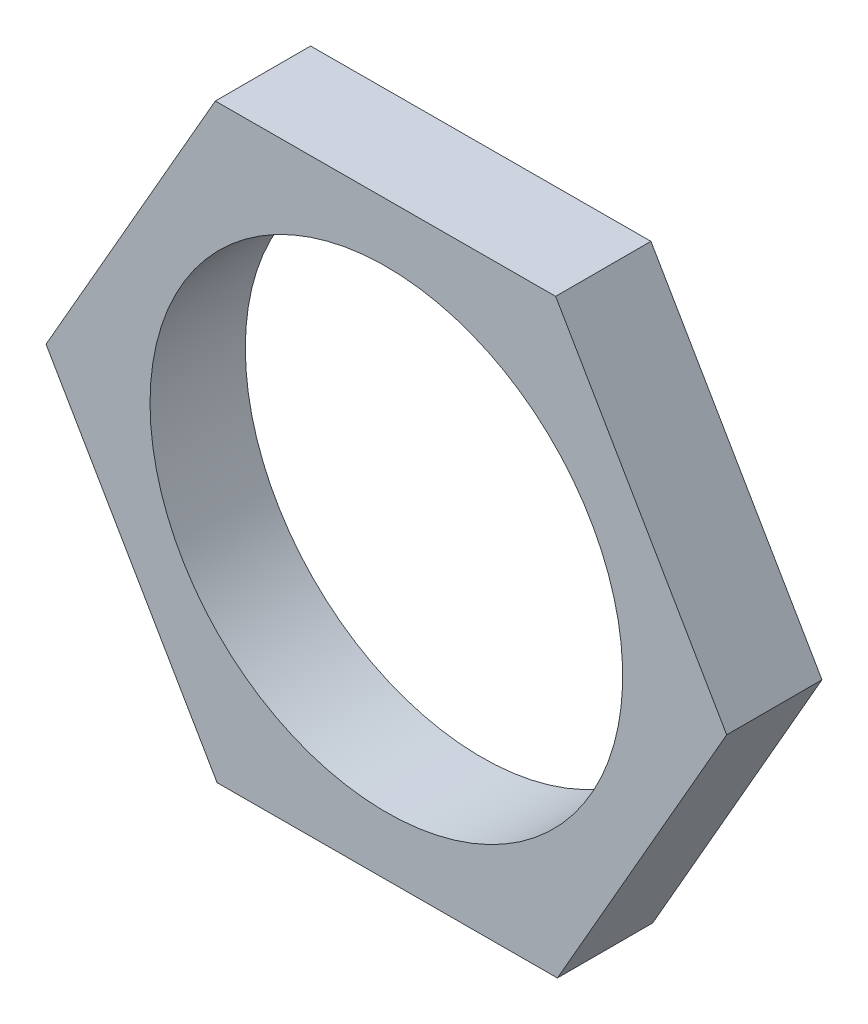
ISO-10303-21;
HEADER;
FILE_DESCRIPTION(('STEP AP214'),'2;1');
FILE_NAME('part.step','',(''),(''),'','','');
FILE_SCHEMA(('AUTOMOTIVE_DESIGN { 1 0 10303 214 1 1 1 1 }'));
ENDSEC;
DATA;
#1=APPLICATION_CONTEXT('core data for automotive mechanical design processes');
#2=APPLICATION_PROTOCOL_DEFINITION('international standard','automotive_design',2000,#1);
#3=PRODUCT_CONTEXT('',#1,'mechanical');
#4=PRODUCT('Part','Part','',(#3));
#5=PRODUCT_RELATED_PRODUCT_CATEGORY('part','',(#4));
#6=PRODUCT_DEFINITION_FORMATION('','',#4);
#7=PRODUCT_DEFINITION_CONTEXT('part definition',#1,'design');
#8=PRODUCT_DEFINITION('design','',#6,#7);
#9=PRODUCT_DEFINITION_SHAPE('','',#8);
#10=(LENGTH_UNIT() NAMED_UNIT(*) SI_UNIT(.MILLI.,.METRE.));
#11=(NAMED_UNIT(*) PLANE_ANGLE_UNIT() SI_UNIT($,.RADIAN.));
#12=(NAMED_UNIT(*) SI_UNIT($,.STERADIAN.) SOLID_ANGLE_UNIT());
#13=UNCERTAINTY_MEASURE_WITH_UNIT(LENGTH_MEASURE(1.E-05),#10,'distance_accuracy_value','');
#14=(GEOMETRIC_REPRESENTATION_CONTEXT(3) GLOBAL_UNCERTAINTY_ASSIGNED_CONTEXT((#13)) GLOBAL_UNIT_ASSIGNED_CONTEXT((#10,
#11,#12)) REPRESENTATION_CONTEXT('',''));
#15=CARTESIAN_POINT('',(0.,0.,0.));
#16=DIRECTION('',(0.,0.,1.));
#17=DIRECTION('',(1.,0.,0.));
#18=AXIS2_PLACEMENT_3D('',#15,#16,#17);
#19=CARTESIAN_POINT('',(7.14371837927621,0.021255119177275,2.));
#20=DIRECTION('',(-0.864533898071232,-0.502574510978981,0.));
#21=DIRECTION('',(0.502574510978981,-0.864533898071232,0.));
#22=AXIS2_PLACEMENT_3D('',#19,#20,#21);
#23=PLANE('',#22);
#24=DIRECTION('',(-0.502574510978981,0.864533898071232,0.));
#25=VECTOR('',#24,1.);
#26=CARTESIAN_POINT('',(7.14371837927621,0.021255119177275,0.));
#27=LINE('',#26,#25);
#28=CARTESIAN_POINT('',(7.14371837927621,0.021255119177275,0.));
#29=VERTEX_POINT('',#28);
#30=CARTESIAN_POINT('',(3.55345171647012,6.19726915352364,0.));
#31=VERTEX_POINT('',#30);
#32=EDGE_CURVE('E115',#29,#31,#27,.T.);
#33=ORIENTED_EDGE('',*,*,#32,.T.);
#34=DIRECTION('',(0.,0.,-1.));
#35=VECTOR('',#34,1.);
#36=CARTESIAN_POINT('',(3.55345171647012,6.19726915352364,2.));
#37=LINE('',#36,#35);
#38=CARTESIAN_POINT('',(3.55345171647012,6.19726915352364,2.));
#39=VERTEX_POINT('',#38);
#40=EDGE_CURVE('E11',#39,#31,#37,.T.);
#41=ORIENTED_EDGE('',*,*,#40,.F.);
#42=DIRECTION('',(-0.502574510978981,0.864533898071232,0.));
#43=VECTOR('',#42,1.);
#44=CARTESIAN_POINT('',(7.14371837927621,0.021255119177275,2.));
#45=LINE('',#44,#43);
#46=CARTESIAN_POINT('',(7.14371837927621,0.021255119177275,2.));
#47=VERTEX_POINT('',#46);
#48=EDGE_CURVE('E126',#47,#39,#45,.T.);
#49=ORIENTED_EDGE('',*,*,#48,.F.);
#50=DIRECTION('',(0.,0.,-1.));
#51=VECTOR('',#50,1.);
#52=CARTESIAN_POINT('',(7.14371837927621,0.021255119177275,2.));
#53=LINE('',#52,#51);
#54=EDGE_CURVE('E111',#47,#29,#53,.T.);
#55=ORIENTED_EDGE('',*,*,#54,.T.);
#56=EDGE_LOOP('',(#33,#41,#49,#55));
#57=FACE_BOUND('',#56,.T.);
#58=ADVANCED_FACE('F31',(#57),#23,.F.);
#59=CARTESIAN_POINT('',(3.55345171647012,6.19726915352364,2.));
#60=DIRECTION('',(0.00297534476672245,-0.999995573651963,0.));
#61=DIRECTION('',(0.999995573651963,0.00297534476672245,0.));
#62=AXIS2_PLACEMENT_3D('',#59,#60,#61);
#63=PLANE('',#62);
#64=DIRECTION('',(-0.999995573651963,-0.00297534476672245,0.));
#65=VECTOR('',#64,1.);
#66=CARTESIAN_POINT('',(3.55345171647012,6.19726915352364,0.));
#67=LINE('',#66,#65);
#68=CARTESIAN_POINT('',(-3.59026666280609,6.17601403434636,0.));
#69=VERTEX_POINT('',#68);
#70=EDGE_CURVE('E118',#31,#69,#67,.T.);
#71=ORIENTED_EDGE('',*,*,#70,.T.);
#72=DIRECTION('',(0.,0.,-1.));
#73=VECTOR('',#72,1.);
#74=CARTESIAN_POINT('',(-3.59026666280609,6.17601403434636,2.));
#75=LINE('',#74,#73);
#76=CARTESIAN_POINT('',(-3.59026666280609,6.17601403434636,2.));
#77=VERTEX_POINT('',#76);
#78=EDGE_CURVE('E39',#77,#69,#75,.T.);
#79=ORIENTED_EDGE('',*,*,#78,.F.);
#80=DIRECTION('',(-0.999995573651963,-0.00297534476672245,0.));
#81=VECTOR('',#80,1.);
#82=CARTESIAN_POINT('',(3.55345171647012,6.19726915352364,2.));
#83=LINE('',#82,#81);
#84=EDGE_CURVE('E84',#39,#77,#83,.T.);
#85=ORIENTED_EDGE('',*,*,#84,.F.);
#86=ORIENTED_EDGE('',*,*,#40,.T.);
#87=EDGE_LOOP('',(#71,#79,#85,#86));
#88=FACE_BOUND('',#87,.T.);
#89=ADVANCED_FACE('F151',(#88),#63,.F.);
#90=CARTESIAN_POINT('',(-3.59026666280609,6.17601403434636,2.));
#91=DIRECTION('',(0.867509242837954,-0.497421062672983,0.));
#92=DIRECTION('',(0.497421062672983,0.867509242837954,0.));
#93=AXIS2_PLACEMENT_3D('',#90,#91,#92);
#94=PLANE('',#93);
#95=DIRECTION('',(-0.497421062672983,-0.867509242837954,0.));
#96=VECTOR('',#95,1.);
#97=CARTESIAN_POINT('',(-3.59026666280609,6.17601403434636,0.));
#98=LINE('',#97,#96);
#99=CARTESIAN_POINT('',(-7.14371837927621,-0.0212551191772762,0.));
#100=VERTEX_POINT('',#99);
#101=EDGE_CURVE('E121',#69,#100,#98,.T.);
#102=ORIENTED_EDGE('',*,*,#101,.T.);
#103=DIRECTION('',(0.,0.,-1.));
#104=VECTOR('',#103,1.);
#105=CARTESIAN_POINT('',(-7.14371837927621,-0.0212551191772762,2.));
#106=LINE('',#105,#104);
#107=CARTESIAN_POINT('',(-7.14371837927621,-0.0212551191772762,2.));
#108=VERTEX_POINT('',#107);
#109=EDGE_CURVE('E106',#108,#100,#106,.T.);
#110=ORIENTED_EDGE('',*,*,#109,.F.);
#111=DIRECTION('',(-0.497421062672983,-0.867509242837954,0.));
#112=VECTOR('',#111,1.);
#113=CARTESIAN_POINT('',(-3.59026666280609,6.17601403434636,2.));
#114=LINE('',#113,#112);
#115=EDGE_CURVE('E97',#77,#108,#114,.T.);
#116=ORIENTED_EDGE('',*,*,#115,.F.);
#117=ORIENTED_EDGE('',*,*,#78,.T.);
#118=EDGE_LOOP('',(#102,#110,#116,#117));
#119=FACE_BOUND('',#118,.T.);
#120=ADVANCED_FACE('F132',(#119),#94,.F.);
#121=CARTESIAN_POINT('',(-7.14371837927621,-0.0212551191772762,2.));
#122=DIRECTION('',(0.864533898071232,0.502574510978981,0.));
#123=DIRECTION('',(-0.502574510978981,0.864533898071232,0.));
#124=AXIS2_PLACEMENT_3D('',#121,#122,#123);
#125=PLANE('',#124);
#126=DIRECTION('',(0.502574510978981,-0.864533898071231,0.));
#127=VECTOR('',#126,1.);
#128=CARTESIAN_POINT('',(-7.14371837927621,-0.0212551191772762,0.));
#129=LINE('',#128,#127);
#130=CARTESIAN_POINT('',(-3.55345171647012,-6.19726915352364,0.));
#131=VERTEX_POINT('',#130);
#132=EDGE_CURVE('E105',#100,#131,#129,.T.);
#133=ORIENTED_EDGE('',*,*,#132,.T.);
#134=DIRECTION('',(0.,0.,-1.));
#135=VECTOR('',#134,1.);
#136=CARTESIAN_POINT('',(-3.55345171647012,-6.19726915352364,2.));
#137=LINE('',#136,#135);
#138=CARTESIAN_POINT('',(-3.55345171647012,-6.19726915352364,2.));
#139=VERTEX_POINT('',#138);
#140=EDGE_CURVE('E102',#139,#131,#137,.T.);
#141=ORIENTED_EDGE('',*,*,#140,.F.);
#142=DIRECTION('',(0.502574510978981,-0.864533898071231,0.));
#143=VECTOR('',#142,1.);
#144=CARTESIAN_POINT('',(-7.14371837927621,-0.0212551191772762,2.));
#145=LINE('',#144,#143);
#146=EDGE_CURVE('E91',#108,#139,#145,.T.);
#147=ORIENTED_EDGE('',*,*,#146,.F.);
#148=ORIENTED_EDGE('',*,*,#109,.T.);
#149=EDGE_LOOP('',(#133,#141,#147,#148));
#150=FACE_BOUND('',#149,.T.);
#151=ADVANCED_FACE('F103',(#150),#125,.F.);
#152=CARTESIAN_POINT('',(-3.55345171647012,-6.19726915352364,2.));
#153=DIRECTION('',(-0.00297534476672269,0.999995573651963,0.));
#154=DIRECTION('',(-0.999995573651963,-0.00297534476672269,0.));
#155=AXIS2_PLACEMENT_3D('',#152,#153,#154);
#156=PLANE('',#155);
#157=DIRECTION('',(0.999995573651963,0.00297534476672269,0.));
#158=VECTOR('',#157,1.);
#159=CARTESIAN_POINT('',(-3.55345171647012,-6.19726915352364,0.));
#160=LINE('',#159,#158);
#161=CARTESIAN_POINT('',(3.59026666280609,-6.17601403434636,0.));
#162=VERTEX_POINT('',#161);
#163=EDGE_CURVE('E70',#131,#162,#160,.T.);
#164=ORIENTED_EDGE('',*,*,#163,.T.);
#165=DIRECTION('',(0.,0.,-1.));
#166=VECTOR('',#165,1.);
#167=CARTESIAN_POINT('',(3.59026666280609,-6.17601403434636,2.));
#168=LINE('',#167,#166);
#169=CARTESIAN_POINT('',(3.59026666280609,-6.17601403434636,2.));
#170=VERTEX_POINT('',#169);
#171=EDGE_CURVE('E107',#170,#162,#168,.T.);
#172=ORIENTED_EDGE('',*,*,#171,.F.);
#173=DIRECTION('',(0.999995573651963,0.00297534476672269,0.));
#174=VECTOR('',#173,1.);
#175=CARTESIAN_POINT('',(-3.55345171647012,-6.19726915352364,2.));
#176=LINE('',#175,#174);
#177=EDGE_CURVE('E95',#139,#170,#176,.T.);
#178=ORIENTED_EDGE('',*,*,#177,.F.);
#179=ORIENTED_EDGE('',*,*,#140,.T.);
#180=EDGE_LOOP('',(#164,#172,#178,#179));
#181=FACE_BOUND('',#180,.T.);
#182=ADVANCED_FACE('F109',(#181),#156,.F.);
#183=CARTESIAN_POINT('',(3.59026666280609,-6.17601403434636,2.));
#184=DIRECTION('',(-0.867509242837954,0.497421062672983,0.));
#185=DIRECTION('',(-0.497421062672983,-0.867509242837954,0.));
#186=AXIS2_PLACEMENT_3D('',#183,#184,#185);
#187=PLANE('',#186);
#188=DIRECTION('',(0.497421062672983,0.867509242837954,0.));
#189=VECTOR('',#188,1.);
#190=CARTESIAN_POINT('',(3.59026666280609,-6.17601403434636,0.));
#191=LINE('',#190,#189);
#192=EDGE_CURVE('E76',#162,#29,#191,.T.);
#193=ORIENTED_EDGE('',*,*,#192,.T.);
#194=ORIENTED_EDGE('',*,*,#54,.F.);
#195=DIRECTION('',(0.497421062672983,0.867509242837954,0.));
#196=VECTOR('',#195,1.);
#197=CARTESIAN_POINT('',(3.59026666280609,-6.17601403434636,2.));
#198=LINE('',#197,#196);
#199=EDGE_CURVE('E47',#170,#47,#198,.T.);
#200=ORIENTED_EDGE('',*,*,#199,.F.);
#201=ORIENTED_EDGE('',*,*,#171,.T.);
#202=EDGE_LOOP('',(#193,#194,#200,#201));
#203=FACE_BOUND('',#202,.T.);
#204=ADVANCED_FACE('F139',(#203),#187,.F.);
#205=CARTESIAN_POINT('',(3.55345171647012,6.19726915352364,2.));
#206=DIRECTION('',(0.,0.,1.));
#207=DIRECTION('',(1.,0.,0.));
#208=AXIS2_PLACEMENT_3D('',#205,#206,#207);
#209=PLANE('',#208);
#210=CARTESIAN_POINT('',(0.,0.,2.));
#211=DIRECTION('',(0.,0.,-1.));
#212=DIRECTION('',(-1.,0.,0.));
#213=AXIS2_PLACEMENT_3D('',#210,#211,#212);
#214=CIRCLE('',#213,4.9609375);
#215=CARTESIAN_POINT('',(-4.9609375,0.,2.));
#216=VERTEX_POINT('',#215);
#217=EDGE_CURVE('E119',#216,#216,#214,.T.);
#218=ORIENTED_EDGE('',*,*,#217,.T.);
#219=EDGE_LOOP('',(#218));
#220=FACE_BOUND('',#219,.T.);
#221=ORIENTED_EDGE('',*,*,#48,.T.);
#222=ORIENTED_EDGE('',*,*,#84,.T.);
#223=ORIENTED_EDGE('',*,*,#115,.T.);
#224=ORIENTED_EDGE('',*,*,#146,.T.);
#225=ORIENTED_EDGE('',*,*,#177,.T.);
#226=ORIENTED_EDGE('',*,*,#199,.T.);
#227=EDGE_LOOP('',(#221,#222,#223,#224,#225,#226));
#228=FACE_BOUND('',#227,.T.);
#229=ADVANCED_FACE('F93',(#220,#228),#209,.T.);
#230=CARTESIAN_POINT('',(3.55345171647012,6.19726915352364,0.));
#231=DIRECTION('',(0.,0.,1.));
#232=DIRECTION('',(1.,0.,0.));
#233=AXIS2_PLACEMENT_3D('',#230,#231,#232);
#234=PLANE('',#233);
#235=CARTESIAN_POINT('',(0.,0.,0.));
#236=DIRECTION('',(0.,0.,-1.));
#237=DIRECTION('',(-1.,0.,0.));
#238=AXIS2_PLACEMENT_3D('',#235,#236,#237);
#239=CIRCLE('',#238,4.9609375);
#240=CARTESIAN_POINT('',(-4.9609375,0.,0.));
#241=VERTEX_POINT('',#240);
#242=EDGE_CURVE('E206',#241,#241,#239,.T.);
#243=ORIENTED_EDGE('',*,*,#242,.F.);
#244=EDGE_LOOP('',(#243));
#245=FACE_BOUND('',#244,.T.);
#246=ORIENTED_EDGE('',*,*,#32,.F.);
#247=ORIENTED_EDGE('',*,*,#192,.F.);
#248=ORIENTED_EDGE('',*,*,#163,.F.);
#249=ORIENTED_EDGE('',*,*,#132,.F.);
#250=ORIENTED_EDGE('',*,*,#101,.F.);
#251=ORIENTED_EDGE('',*,*,#70,.F.);
#252=EDGE_LOOP('',(#246,#247,#248,#249,#250,#251));
#253=FACE_BOUND('',#252,.T.);
#254=ADVANCED_FACE('F135',(#245,#253),#234,.F.);
#255=CARTESIAN_POINT('',(0.,0.,2.));
#256=DIRECTION('',(0.,0.,-1.));
#257=DIRECTION('',(-1.,0.,0.));
#258=AXIS2_PLACEMENT_3D('',#255,#256,#257);
#259=CYLINDRICAL_SURFACE('',#258,4.9609375);
#260=ORIENTED_EDGE('',*,*,#217,.F.);
#261=EDGE_LOOP('',(#260));
#262=FACE_BOUND('',#261,.T.);
#263=ORIENTED_EDGE('',*,*,#242,.T.);
#264=EDGE_LOOP('',(#263));
#265=FACE_BOUND('',#264,.T.);
#266=ADVANCED_FACE('F188',(#262,#265),#259,.F.);
#267=CLOSED_SHELL('',(#58,#89,#120,#151,#182,#204,#229,#254,#266));
#268=MANIFOLD_SOLID_BREP('B2',#267);
#269=ADVANCED_BREP_SHAPE_REPRESENTATION('',(#18,#268),#14);
#270=SHAPE_DEFINITION_REPRESENTATION(#9,#269);
ENDSEC;
END-ISO-10303-21;
